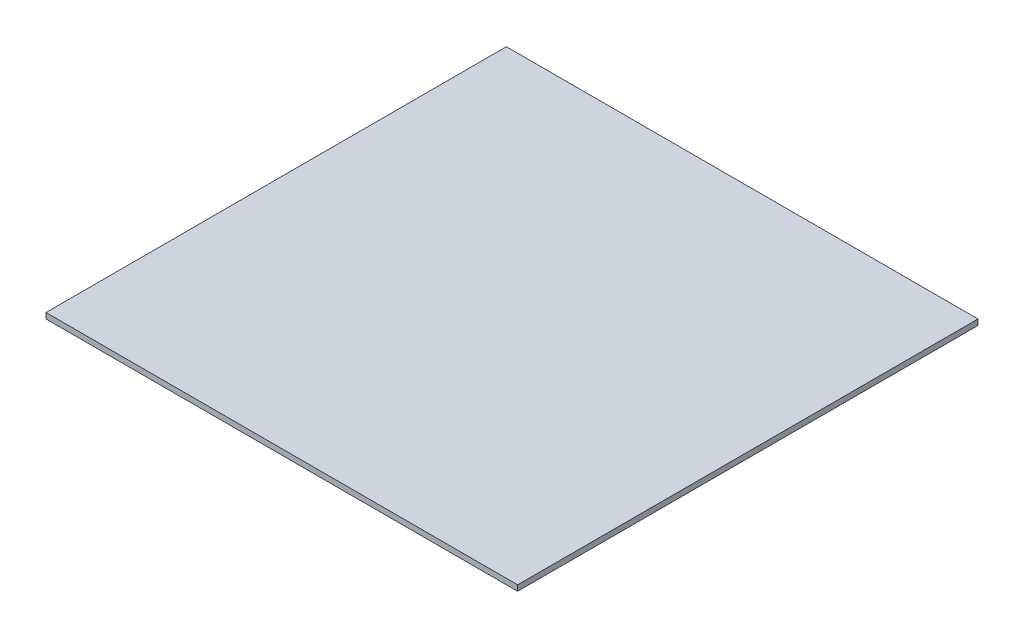
ISO-10303-21;
HEADER;
FILE_DESCRIPTION(('STEP AP214'),'2;1');
FILE_NAME('part.step','',(''),(''),'','','');
FILE_SCHEMA(('AUTOMOTIVE_DESIGN { 1 0 10303 214 1 1 1 1 }'));
ENDSEC;
DATA;
#1=APPLICATION_CONTEXT('core data for automotive mechanical design processes');
#2=APPLICATION_PROTOCOL_DEFINITION('international standard','automotive_design',2000,#1);
#3=PRODUCT_CONTEXT('',#1,'mechanical');
#4=PRODUCT('Part','Part','',(#3));
#5=PRODUCT_RELATED_PRODUCT_CATEGORY('part','',(#4));
#6=PRODUCT_DEFINITION_FORMATION('','',#4);
#7=PRODUCT_DEFINITION_CONTEXT('part definition',#1,'design');
#8=PRODUCT_DEFINITION('design','',#6,#7);
#9=PRODUCT_DEFINITION_SHAPE('','',#8);
#10=(LENGTH_UNIT() NAMED_UNIT(*) SI_UNIT(.MILLI.,.METRE.));
#11=(NAMED_UNIT(*) PLANE_ANGLE_UNIT() SI_UNIT($,.RADIAN.));
#12=(NAMED_UNIT(*) SI_UNIT($,.STERADIAN.) SOLID_ANGLE_UNIT());
#13=UNCERTAINTY_MEASURE_WITH_UNIT(LENGTH_MEASURE(1.E-05),#10,'distance_accuracy_value','');
#14=(GEOMETRIC_REPRESENTATION_CONTEXT(3) GLOBAL_UNCERTAINTY_ASSIGNED_CONTEXT((#13)) GLOBAL_UNIT_ASSIGNED_CONTEXT((#10,
#11,#12)) REPRESENTATION_CONTEXT('',''));
#15=CARTESIAN_POINT('',(0.,0.,0.));
#16=DIRECTION('',(0.,0.,1.));
#17=DIRECTION('',(1.,0.,0.));
#18=AXIS2_PLACEMENT_3D('',#15,#16,#17);
#19=CARTESIAN_POINT('',(533.4,12.7,520.7));
#20=DIRECTION('',(-1.,0.,0.));
#21=DIRECTION('',(0.,0.,1.));
#22=AXIS2_PLACEMENT_3D('',#19,#20,#21);
#23=PLANE('',#22);
#24=DIRECTION('',(0.,0.,-1.));
#25=VECTOR('',#24,1.);
#26=CARTESIAN_POINT('',(533.4,0.,520.7));
#27=LINE('',#26,#25);
#28=CARTESIAN_POINT('',(533.4,0.,520.7));
#29=VERTEX_POINT('',#28);
#30=CARTESIAN_POINT('',(533.4,0.,-520.7));
#31=VERTEX_POINT('',#30);
#32=EDGE_CURVE('E107',#29,#31,#27,.T.);
#33=ORIENTED_EDGE('',*,*,#32,.T.);
#34=DIRECTION('',(0.,-1.,0.));
#35=VECTOR('',#34,1.);
#36=CARTESIAN_POINT('',(533.4,12.7,-520.7));
#37=LINE('',#36,#35);
#38=CARTESIAN_POINT('',(533.4,12.7,-520.7));
#39=VERTEX_POINT('',#38);
#40=EDGE_CURVE('E11',#39,#31,#37,.T.);
#41=ORIENTED_EDGE('',*,*,#40,.F.);
#42=DIRECTION('',(0.,0.,-1.));
#43=VECTOR('',#42,1.);
#44=CARTESIAN_POINT('',(533.4,12.7,520.7));
#45=LINE('',#44,#43);
#46=CARTESIAN_POINT('',(533.4,12.7,520.7));
#47=VERTEX_POINT('',#46);
#48=EDGE_CURVE('E91',#47,#39,#45,.T.);
#49=ORIENTED_EDGE('',*,*,#48,.F.);
#50=DIRECTION('',(0.,-1.,0.));
#51=VECTOR('',#50,1.);
#52=CARTESIAN_POINT('',(533.4,12.7,520.7));
#53=LINE('',#52,#51);
#54=EDGE_CURVE('E103',#47,#29,#53,.T.);
#55=ORIENTED_EDGE('',*,*,#54,.T.);
#56=EDGE_LOOP('',(#33,#41,#49,#55));
#57=FACE_BOUND('',#56,.T.);
#58=ADVANCED_FACE('F39',(#57),#23,.F.);
#59=CARTESIAN_POINT('',(-533.4,12.7,-520.7));
#60=DIRECTION('',(0.,0.,1.));
#61=DIRECTION('',(1.,0.,0.));
#62=AXIS2_PLACEMENT_3D('',#59,#60,#61);
#63=PLANE('',#62);
#64=DIRECTION('',(-1.,0.,0.));
#65=VECTOR('',#64,1.);
#66=CARTESIAN_POINT('',(-533.4,0.,-520.7));
#67=LINE('',#66,#65);
#68=CARTESIAN_POINT('',(-533.4,0.,-520.7));
#69=VERTEX_POINT('',#68);
#70=EDGE_CURVE('E96',#31,#69,#67,.T.);
#71=ORIENTED_EDGE('',*,*,#70,.T.);
#72=DIRECTION('',(0.,-1.,0.));
#73=VECTOR('',#72,1.);
#74=CARTESIAN_POINT('',(-533.4,12.7,-520.7));
#75=LINE('',#74,#73);
#76=CARTESIAN_POINT('',(-533.4,12.7,-520.7));
#77=VERTEX_POINT('',#76);
#78=EDGE_CURVE('E48',#77,#69,#75,.T.);
#79=ORIENTED_EDGE('',*,*,#78,.F.);
#80=DIRECTION('',(-1.,0.,0.));
#81=VECTOR('',#80,1.);
#82=CARTESIAN_POINT('',(-533.4,12.7,-520.7));
#83=LINE('',#82,#81);
#84=EDGE_CURVE('E86',#39,#77,#83,.T.);
#85=ORIENTED_EDGE('',*,*,#84,.F.);
#86=ORIENTED_EDGE('',*,*,#40,.T.);
#87=EDGE_LOOP('',(#71,#79,#85,#86));
#88=FACE_BOUND('',#87,.T.);
#89=ADVANCED_FACE('F95',(#88),#63,.F.);
#90=CARTESIAN_POINT('',(-533.4,12.7,520.7));
#91=DIRECTION('',(1.,0.,0.));
#92=DIRECTION('',(0.,0.,-1.));
#93=AXIS2_PLACEMENT_3D('',#90,#91,#92);
#94=PLANE('',#93);
#95=DIRECTION('',(0.,0.,1.));
#96=VECTOR('',#95,1.);
#97=CARTESIAN_POINT('',(-533.4,0.,520.7));
#98=LINE('',#97,#96);
#99=CARTESIAN_POINT('',(-533.4,0.,520.7));
#100=VERTEX_POINT('',#99);
#101=EDGE_CURVE('E73',#69,#100,#98,.T.);
#102=ORIENTED_EDGE('',*,*,#101,.T.);
#103=DIRECTION('',(0.,-1.,0.));
#104=VECTOR('',#103,1.);
#105=CARTESIAN_POINT('',(-533.4,12.7,520.7));
#106=LINE('',#105,#104);
#107=CARTESIAN_POINT('',(-533.4,12.7,520.7));
#108=VERTEX_POINT('',#107);
#109=EDGE_CURVE('E98',#108,#100,#106,.T.);
#110=ORIENTED_EDGE('',*,*,#109,.F.);
#111=DIRECTION('',(0.,0.,1.));
#112=VECTOR('',#111,1.);
#113=CARTESIAN_POINT('',(-533.4,12.7,520.7));
#114=LINE('',#113,#112);
#115=EDGE_CURVE('E89',#77,#108,#114,.T.);
#116=ORIENTED_EDGE('',*,*,#115,.F.);
#117=ORIENTED_EDGE('',*,*,#78,.T.);
#118=EDGE_LOOP('',(#102,#110,#116,#117));
#119=FACE_BOUND('',#118,.T.);
#120=ADVANCED_FACE('F99',(#119),#94,.F.);
#121=CARTESIAN_POINT('',(-533.4,12.7,520.7));
#122=DIRECTION('',(0.,0.,-1.));
#123=DIRECTION('',(-1.,0.,0.));
#124=AXIS2_PLACEMENT_3D('',#121,#122,#123);
#125=PLANE('',#124);
#126=DIRECTION('',(1.,0.,0.));
#127=VECTOR('',#126,1.);
#128=CARTESIAN_POINT('',(-533.4,0.,520.7));
#129=LINE('',#128,#127);
#130=EDGE_CURVE('E79',#100,#29,#129,.T.);
#131=ORIENTED_EDGE('',*,*,#130,.T.);
#132=ORIENTED_EDGE('',*,*,#54,.F.);
#133=DIRECTION('',(1.,0.,0.));
#134=VECTOR('',#133,1.);
#135=CARTESIAN_POINT('',(-533.4,12.7,520.7));
#136=LINE('',#135,#134);
#137=EDGE_CURVE('E56',#108,#47,#136,.T.);
#138=ORIENTED_EDGE('',*,*,#137,.F.);
#139=ORIENTED_EDGE('',*,*,#109,.T.);
#140=EDGE_LOOP('',(#131,#132,#138,#139));
#141=FACE_BOUND('',#140,.T.);
#142=ADVANCED_FACE('F120',(#141),#125,.F.);
#143=CARTESIAN_POINT('',(0.,12.7,0.));
#144=DIRECTION('',(0.,-1.,0.));
#145=DIRECTION('',(0.,0.,-1.));
#146=AXIS2_PLACEMENT_3D('',#143,#144,#145);
#147=PLANE('',#146);
#148=ORIENTED_EDGE('',*,*,#48,.T.);
#149=ORIENTED_EDGE('',*,*,#84,.T.);
#150=ORIENTED_EDGE('',*,*,#115,.T.);
#151=ORIENTED_EDGE('',*,*,#137,.T.);
#152=EDGE_LOOP('',(#148,#149,#150,#151));
#153=FACE_BOUND('',#152,.T.);
#154=ADVANCED_FACE('F87',(#153),#147,.F.);
#155=CARTESIAN_POINT('',(0.,0.,0.));
#156=DIRECTION('',(0.,-1.,0.));
#157=DIRECTION('',(0.,0.,-1.));
#158=AXIS2_PLACEMENT_3D('',#155,#156,#157);
#159=PLANE('',#158);
#160=ORIENTED_EDGE('',*,*,#32,.F.);
#161=ORIENTED_EDGE('',*,*,#130,.F.);
#162=ORIENTED_EDGE('',*,*,#101,.F.);
#163=ORIENTED_EDGE('',*,*,#70,.F.);
#164=EDGE_LOOP('',(#160,#161,#162,#163));
#165=FACE_BOUND('',#164,.T.);
#166=ADVANCED_FACE('F123',(#165),#159,.T.);
#167=CLOSED_SHELL('',(#58,#89,#120,#142,#154,#166));
#168=MANIFOLD_SOLID_BREP('B2',#167);
#169=ADVANCED_BREP_SHAPE_REPRESENTATION('',(#18,#168),#14);
#170=SHAPE_DEFINITION_REPRESENTATION(#9,#169);
ENDSEC;
END-ISO-10303-21;
